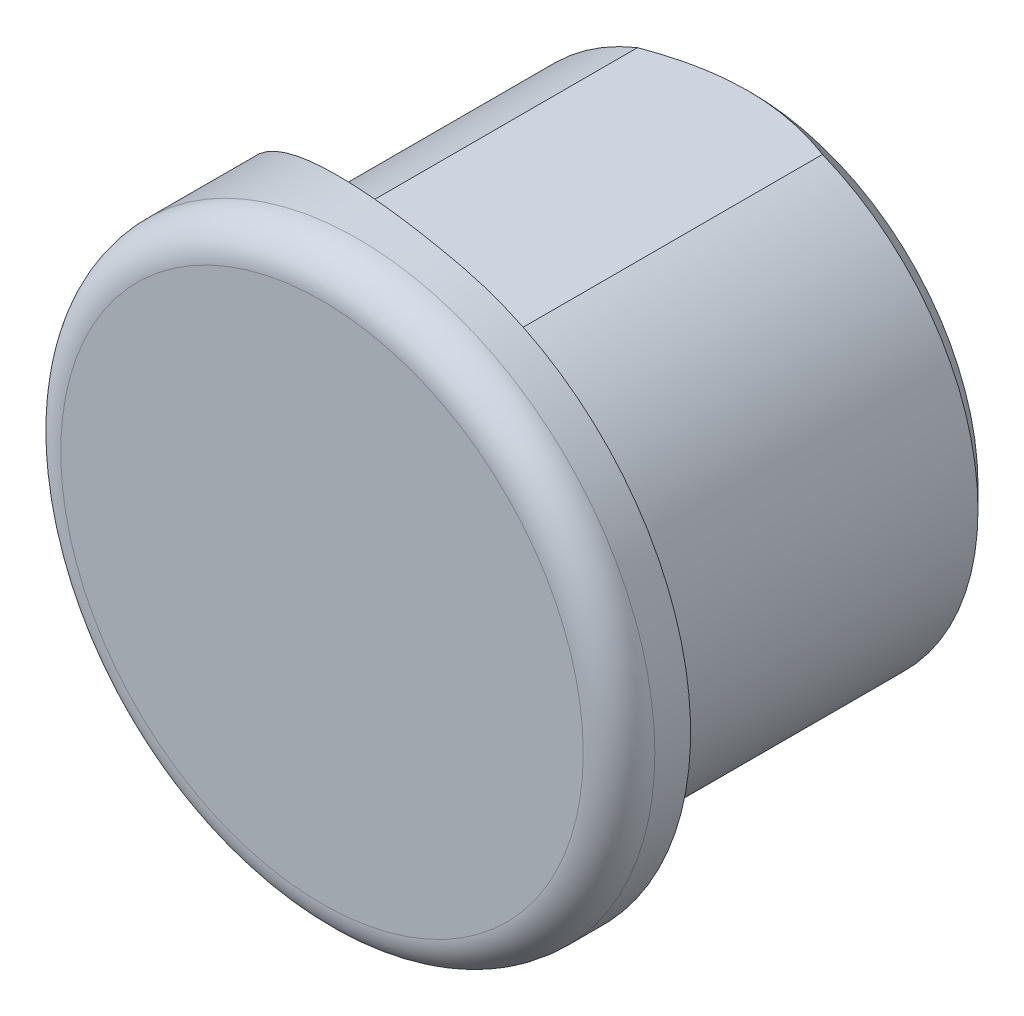
ISO-10303-21;
HEADER;
FILE_DESCRIPTION(('STEP AP214'),'2;1');
FILE_NAME('part.step','',(''),(''),'','','');
FILE_SCHEMA(('AUTOMOTIVE_DESIGN { 1 0 10303 214 1 1 1 1 }'));
ENDSEC;
DATA;
#1=APPLICATION_CONTEXT('core data for automotive mechanical design processes');
#2=APPLICATION_PROTOCOL_DEFINITION('international standard','automotive_design',2000,#1);
#3=PRODUCT_CONTEXT('',#1,'mechanical');
#4=PRODUCT('Part','Part','',(#3));
#5=PRODUCT_RELATED_PRODUCT_CATEGORY('part','',(#4));
#6=PRODUCT_DEFINITION_FORMATION('','',#4);
#7=PRODUCT_DEFINITION_CONTEXT('part definition',#1,'design');
#8=PRODUCT_DEFINITION('design','',#6,#7);
#9=PRODUCT_DEFINITION_SHAPE('','',#8);
#10=(LENGTH_UNIT() NAMED_UNIT(*) SI_UNIT(.MILLI.,.METRE.));
#11=(NAMED_UNIT(*) PLANE_ANGLE_UNIT() SI_UNIT($,.RADIAN.));
#12=(NAMED_UNIT(*) SI_UNIT($,.STERADIAN.) SOLID_ANGLE_UNIT());
#13=UNCERTAINTY_MEASURE_WITH_UNIT(LENGTH_MEASURE(1.E-05),#10,'distance_accuracy_value','');
#14=(GEOMETRIC_REPRESENTATION_CONTEXT(3) GLOBAL_UNCERTAINTY_ASSIGNED_CONTEXT((#13)) GLOBAL_UNIT_ASSIGNED_CONTEXT((#10,
#11,#12)) REPRESENTATION_CONTEXT('',''));
#15=CARTESIAN_POINT('',(0.,0.,0.));
#16=DIRECTION('',(0.,0.,1.));
#17=DIRECTION('',(1.,0.,0.));
#18=AXIS2_PLACEMENT_3D('',#15,#16,#17);
#19=CARTESIAN_POINT('',(-38.,67.,-5.));
#20=DIRECTION('',(0.,0.,1.));
#21=DIRECTION('',(1.,0.,0.));
#22=AXIS2_PLACEMENT_3D('',#19,#20,#21);
#23=CYLINDRICAL_SURFACE('',#22,3.46500000000001);
#24=DIRECTION('',(0.,0.,-1.));
#25=VECTOR('',#24,1.);
#26=CARTESIAN_POINT('',(-39.292284798332,70.215,1.001));
#27=LINE('',#26,#25);
#28=CARTESIAN_POINT('',(-39.292284798332,70.215,-0.325062518872274));
#29=VERTEX_POINT('',#28);
#30=CARTESIAN_POINT('',(-39.292284798332,70.215,-4.69999999999999));
#31=VERTEX_POINT('',#30);
#32=EDGE_CURVE('E88',#29,#31,#27,.T.);
#33=ORIENTED_EDGE('',*,*,#32,.T.);
#34=CARTESIAN_POINT('',(-38.,67.,-4.69999999999999));
#35=DIRECTION('',(0.,0.,1.));
#36=DIRECTION('',(1.,0.,0.));
#37=AXIS2_PLACEMENT_3D('',#34,#35,#36);
#38=CIRCLE('',#37,3.46500000000001);
#39=CARTESIAN_POINT('',(-36.707715201668,70.215,-4.69999999999999));
#40=VERTEX_POINT('',#39);
#41=EDGE_CURVE('E183',#31,#40,#38,.T.);
#42=ORIENTED_EDGE('',*,*,#41,.T.);
#43=DIRECTION('',(0.,0.,-1.));
#44=VECTOR('',#43,1.);
#45=CARTESIAN_POINT('',(-36.707715201668,70.215,1.001));
#46=LINE('',#45,#44);
#47=CARTESIAN_POINT('',(-36.707715201668,70.215,-0.00669751224309338));
#48=VERTEX_POINT('',#47);
#49=EDGE_CURVE('E64',#48,#40,#46,.T.);
#50=ORIENTED_EDGE('',*,*,#49,.F.);
#51=CARTESIAN_POINT('',(-36.707715201668,70.215,-0.00669751224308991));
#52=CARTESIAN_POINT('',(-36.7918183783078,70.2488185204064,-0.00324250262786544));
#53=CARTESIAN_POINT('',(-36.8773057208015,70.2793341167444,-0.00108298050502963));
#54=CARTESIAN_POINT('',(-37.0504348350583,70.3335805805809,0.000450538292791147));
#55=CARTESIAN_POINT('',(-37.1380767139506,70.3573111099645,-0.000175603822327148));
#56=CARTESIAN_POINT('',(-37.314706774626,70.3977626200402,-0.00440390113271462));
#57=CARTESIAN_POINT('',(-37.4036917414405,70.4144982210983,-0.00799980179883816));
#58=CARTESIAN_POINT('',(-37.5824954501393,70.4409436747735,-0.0182529538285457));
#59=CARTESIAN_POINT('',(-37.6723141235488,70.4506540993071,-0.0249099559170122));
#60=CARTESIAN_POINT('',(-37.9422216343316,70.4692000761917,-0.0495622920891564));
#61=CARTESIAN_POINT('',(-38.1227358424848,70.4674444008116,-0.0722383782416016));
#62=CARTESIAN_POINT('',(-38.4792957030401,70.4363558563484,-0.129381444895188));
#63=CARTESIAN_POINT('',(-38.655343795854,70.4070383963328,-0.163841830256444));
#64=CARTESIAN_POINT('',(-38.906675947637,70.345285350215,-0.221595639911068));
#65=CARTESIAN_POINT('',(-38.9854771372491,70.32291024204,-0.240999300845385));
#66=CARTESIAN_POINT('',(-39.140693117377,70.2728687221158,-0.281679130378347));
#67=CARTESIAN_POINT('',(-39.2171125794899,70.2452135408831,-0.302951273845802));
#68=CARTESIAN_POINT('',(-39.292284798332,70.2150000000001,-0.325062518872277));
#69=B_SPLINE_CURVE_WITH_KNOTS('',3,(#51,#52,#53,#54,#55,#56,#57,#58,#59,#60,#61,#62,#63,#64,#65,
#66,#67,#68),.UNSPECIFIED.,.F.,.F.,(4,2,2,2,2,2,2,2,4),(0.,0.272064995928714,0.544143547099019,
0.815650537801927,1.08713542275096,1.63018451754071,2.17293018832914,2.42529291181737,
2.67712473146622),.UNSPECIFIED.);
#70=CARTESIAN_POINT('',(-37.035,70.3279122584588,0.));
#71=VERTEX_POINT('',#70);
#72=EDGE_CURVE('E97',#48,#71,#69,.T.);
#73=ORIENTED_EDGE('',*,*,#72,.T.);
#74=CARTESIAN_POINT('',(-38.,67.,0.));
#75=DIRECTION('',(0.,0.,1.));
#76=DIRECTION('',(1.,0.,0.));
#77=AXIS2_PLACEMENT_3D('',#74,#75,#76);
#78=CIRCLE('',#77,3.46500000000001);
#79=CARTESIAN_POINT('',(-37.035,63.6720877415412,0.));
#80=VERTEX_POINT('',#79);
#81=EDGE_CURVE('E107',#80,#71,#78,.T.);
#82=ORIENTED_EDGE('',*,*,#81,.F.);
#83=CARTESIAN_POINT('',(-34.535,67.,-0.400657923214667));
#84=CARTESIAN_POINT('',(-34.5350011192577,67.0948957281984,-0.400656985389254));
#85=CARTESIAN_POINT('',(-34.5389055021327,67.1898219317335,-0.399368852872305));
#86=CARTESIAN_POINT('',(-34.5544772525292,67.3789822970893,-0.394274555914238));
#87=CARTESIAN_POINT('',(-34.5661491313663,67.4732160245484,-0.390466928172532));
#88=CARTESIAN_POINT('',(-34.6127558877772,67.7541885332388,-0.375441268165278));
#89=CARTESIAN_POINT('',(-34.6592816111299,67.9389586494806,-0.360620993873424));
#90=CARTESIAN_POINT('',(-34.7813833588734,68.2971146514612,-0.323725001024826));
#91=CARTESIAN_POINT('',(-34.8568782801617,68.470530751622,-0.301669563058351));
#92=CARTESIAN_POINT('',(-35.0346734192286,68.8023516732511,-0.253571784396536));
#93=CARTESIAN_POINT('',(-35.1369668349063,68.9607602901056,-0.227530456112169));
#94=CARTESIAN_POINT('',(-35.3695894581378,69.2638124229693,-0.174332423293026));
#95=CARTESIAN_POINT('',(-35.5007291471459,69.4078329346568,-0.147167177437789));
#96=CARTESIAN_POINT('',(-35.7857093632476,69.6722495530427,-0.0968249070936301));
#97=CARTESIAN_POINT('',(-35.9395523068001,69.792643141788,-0.0736483077125131));
#98=CARTESIAN_POINT('',(-36.2666303311044,70.0066542459041,-0.0352792019264993));
#99=CARTESIAN_POINT('',(-36.4399334825967,70.1001734247758,-0.0201158513601304));
#100=CARTESIAN_POINT('',(-36.8003942582355,70.2566425288117,-0.00140975183757399));
#101=CARTESIAN_POINT('',(-36.9875447090844,70.3196081555732,0.00213897132229998));
#102=CARTESIAN_POINT('',(-37.3585226743484,70.4101417603151,-0.0045170584851117));
#103=CARTESIAN_POINT('',(-37.5419178704721,70.4395440495656,-0.0139393400777888));
#104=CARTESIAN_POINT('',(-37.9098962281323,70.4687402686873,-0.0458414078334991));
#105=CARTESIAN_POINT('',(-38.094479209676,70.4685385836859,-0.068319259631799));
#106=CARTESIAN_POINT('',(-38.4541801556865,70.4397099509942,-0.124838159056097));
#107=CARTESIAN_POINT('',(-38.6294183252234,70.411882328781,-0.158536344344614));
#108=CARTESIAN_POINT('',(-38.9715232413143,70.3306606715974,-0.235937337453948));
#109=CARTESIAN_POINT('',(-39.1383881713702,70.2772611152933,-0.279642304813141));
#110=CARTESIAN_POINT('',(-39.4696837733798,70.1432500413001,-0.377411480404669));
#111=CARTESIAN_POINT('',(-39.6334122717408,70.0612402007051,-0.431929416844581));
#112=CARTESIAN_POINT('',(-39.9447447011074,69.8735464599806,-0.546079809336016));
#113=CARTESIAN_POINT('',(-40.092340152915,69.7678501989191,-0.605714925761603));
#114=CARTESIAN_POINT('',(-40.382724685148,69.5235598642113,-0.732246807786706));
#115=CARTESIAN_POINT('',(-40.5235882937771,69.3827437618093,-0.799277584037218));
#116=CARTESIAN_POINT('',(-40.7800987392563,69.0777274904943,-0.929290394936549));
#117=CARTESIAN_POINT('',(-40.8957282896773,68.9135114180864,-0.992269633406572));
#118=CARTESIAN_POINT('',(-41.0484614992409,68.6503627988322,-1.07932975913158));
#119=CARTESIAN_POINT('',(-41.0962979423923,68.5588207582527,-1.10736117138529));
#120=CARTESIAN_POINT('',(-41.1839240673632,68.3709764230694,-1.159749309023));
#121=CARTESIAN_POINT('',(-41.2237181048052,68.2746767404787,-1.18410802165));
#122=CARTESIAN_POINT('',(-41.294675136332,68.0780768734887,-1.22822655587355));
#123=CARTESIAN_POINT('',(-41.3258496853295,67.9777822530421,-1.24799252856462));
#124=CARTESIAN_POINT('',(-41.3791081012437,67.7739143771681,-1.28213352888147));
#125=CARTESIAN_POINT('',(-41.4011940970647,67.6703418956758,-1.29650981891721));
#126=CARTESIAN_POINT('',(-41.4334461318672,67.4754358475762,-1.31763605886592));
#127=CARTESIAN_POINT('',(-41.4448372613958,67.3843878309291,-1.32516512785783));
#128=CARTESIAN_POINT('',(-41.4603592015494,67.2014123130447,-1.33544570046317));
#129=CARTESIAN_POINT('',(-41.4644909869457,67.109484931554,-1.33819784551255));
#130=CARTESIAN_POINT('',(-41.4654201832672,66.9256031903779,-1.33881547526933));
#131=CARTESIAN_POINT('',(-41.4622200474372,66.8336488500067,-1.33668259449584));
#132=CARTESIAN_POINT('',(-41.4485574571683,66.65054665138,-1.32762645527127));
#133=CARTESIAN_POINT('',(-41.4380952964178,66.5593987606612,-1.3207033905433));
#134=CARTESIAN_POINT('',(-41.3991567922284,66.3084016400528,-1.29514526789084));
#135=CARTESIAN_POINT('',(-41.3630005351098,66.150167119285,-1.27159007893166));
#136=CARTESIAN_POINT('',(-41.2698850415623,65.8424143958316,-1.2126047075434));
#137=CARTESIAN_POINT('',(-41.2129195982387,65.6928988092471,-1.17717098228377));
#138=CARTESIAN_POINT('',(-41.0747103407353,65.3932075143471,-1.09436969996753));
#139=CARTESIAN_POINT('',(-40.9918608605046,65.2439796294623,-1.04626269629798));
#140=CARTESIAN_POINT('',(-40.8064224035896,64.9606532947735,-0.943967934044831));
#141=CARTESIAN_POINT('',(-40.7038219304809,64.826563728973,-0.889776641684433));
#142=CARTESIAN_POINT('',(-40.4634534285218,64.5555530744633,-0.77045182146391));
#143=CARTESIAN_POINT('',(-40.3226971434884,64.4214412832022,-0.704928243285893));
#144=CARTESIAN_POINT('',(-40.0201322502592,64.1781205054357,-0.575981722355459));
#145=CARTESIAN_POINT('',(-39.8583127691189,64.0689244612874,-0.512559885895578));
#146=CARTESIAN_POINT('',(-39.5075948292173,63.8733805738751,-0.389312821231469));
#147=CARTESIAN_POINT('',(-39.3177191923377,63.7885385095194,-0.329852799274537));
#148=CARTESIAN_POINT('',(-38.9227606879262,63.6536302915031,-0.223234961128988));
#149=CARTESIAN_POINT('',(-38.7176891958916,63.6035384094773,-0.176068059539049));
#150=CARTESIAN_POINT('',(-38.3159220961729,63.5439552757278,-0.100786488654761));
#151=CARTESIAN_POINT('',(-38.1199008637462,63.5314944461973,-0.0714346881586112));
#152=CARTESIAN_POINT('',(-37.7269724878194,63.5401975142087,-0.027536377717417));
#153=CARTESIAN_POINT('',(-37.5300658651042,63.5613437113143,-0.0129820807159925));
#154=CARTESIAN_POINT('',(-37.1583336236302,63.6338886683361,0.00103459603555801));
#155=CARTESIAN_POINT('',(-36.983027340551,63.6826450020609,0.00164400037690785));
#156=CARTESIAN_POINT('',(-36.6424697354413,63.8068530308265,-0.00781965603974612));
#157=CARTESIAN_POINT('',(-36.477218858977,63.8823059078124,-0.0178931898065255));
#158=CARTESIAN_POINT('',(-36.1598769632398,64.0583395311885,-0.0463988664987246));
#159=CARTESIAN_POINT('',(-36.0078962089916,64.1591079696991,-0.064894322054996));
#160=CARTESIAN_POINT('',(-35.7220175286328,64.382754681577,-0.107155832494376));
#161=CARTESIAN_POINT('',(-35.5881237451018,64.5056380050839,-0.130923091531641));
#162=CARTESIAN_POINT('',(-35.3339116935948,64.7785062773143,-0.181808882945439));
#163=CARTESIAN_POINT('',(-35.2148852828911,64.9296729836955,-0.209042849933061));
#164=CARTESIAN_POINT('',(-35.0032114322688,65.2500528969504,-0.261538577492637));
#165=CARTESIAN_POINT('',(-34.9105817823354,65.4192781692397,-0.286798999719347));
#166=CARTESIAN_POINT('',(-34.7926199931933,65.6852096901427,-0.320583376809268));
#167=CARTESIAN_POINT('',(-34.7565066355997,65.7770021463424,-0.331258845429686));
#168=CARTESIAN_POINT('',(-34.6921888233801,65.9635048078427,-0.350662151748602));
#169=CARTESIAN_POINT('',(-34.6639810801291,66.0582137816615,-0.359390798988086));
#170=CARTESIAN_POINT('',(-34.6157823568693,66.2496513067681,-0.374514950191058));
#171=CARTESIAN_POINT('',(-34.5957734288891,66.3463749543007,-0.380915546983146));
#172=CARTESIAN_POINT('',(-34.5640831796046,66.5412679108087,-0.391133445935712));
#173=CARTESIAN_POINT('',(-34.5523964880248,66.6394362457133,-0.394952413920624));
#174=CARTESIAN_POINT('',(-34.5416182925394,66.7815181372765,-0.398483270080353));
#175=CARTESIAN_POINT('',(-34.5391372354021,66.8251715777705,-0.399297907541584));
#176=CARTESIAN_POINT('',(-34.5358278257751,66.9125478547272,-0.400385451984138));
#177=CARTESIAN_POINT('',(-34.5349994842301,66.9562706916475,-0.400658355378025));
#178=CARTESIAN_POINT('',(-34.535,67.,-0.400657923214667));
#179=B_SPLINE_CURVE_WITH_KNOTS('',3,(#83,#84,#85,#86,#87,#88,#89,#90,#91,#92,#93,#94,#95,#96,
#97,#98,#99,#100,#101,#102,#103,#104,#105,#106,#107,#108,#109,#110,#111,#112,#113,#114,#115,
#116,#117,#118,#119,#120,#121,#122,#123,#124,#125,#126,#127,#128,#129,#130,#131,#132,#133,#134,
#135,#136,#137,#138,#139,#140,#141,#142,#143,#144,#145,#146,#147,#148,#149,#150,#151,#152,#153,
#154,#155,#156,#157,#158,#159,#160,#161,#162,#163,#164,#165,#166,#167,#168,#169,#170,#171,#172,
#173,#174,#175,#176,#177,#178),.UNSPECIFIED.,.T.,.F.,(4,2,2,2,2,2,2,2,2,2,2,2,2,2,2,2,2,2,2,2,2,
2,2,2,2,2,2,2,2,2,2,2,2,2,2,2,2,2,2,2,2,2,2,2,2,2,2,4),(0.,0.284640611948893,0.569446685927191,
1.13976936155237,1.70850685739108,2.27710013363597,2.86436883992426,3.45170009828666,
4.04115387217319,4.63030440165197,5.18542957441174,5.74047251861201,6.27991062964134,
6.81946526535747,7.39030547681752,7.9614442820149,8.58917713224544,9.21733866627191,
9.53802211699978,9.85853142314634,10.1786089618996,10.4986114828974,10.7744128568663,
11.0501771939033,11.3258492742678,11.6015102066413,12.0912349943867,12.5811059750482,
13.1110767275559,13.6413568970471,14.2541948851555,14.8673504877714,15.5127910043381,
16.1577531377056,16.7502830614329,17.342501009842,17.8858142321222,18.4291515117029,
18.9766425929876,19.5242588579601,20.1046453707213,20.6854221124281,20.9827604175396,
21.2799748498674,21.5765351306743,21.8729038695673,22.0040694646897,22.1352359284058),.UNSPECIFIED.);
#180=EDGE_CURVE('E101',#29,#80,#179,.T.);
#181=ORIENTED_EDGE('',*,*,#180,.F.);
#182=EDGE_LOOP('',(#33,#42,#50,#73,#82,#181));
#183=FACE_BOUND('',#182,.T.);
#184=ADVANCED_FACE('F43',(#183),#23,.T.);
#185=CARTESIAN_POINT('',(-38.,67.,-5.));
#186=DIRECTION('',(0.,0.,1.));
#187=DIRECTION('',(1.,0.,0.));
#188=AXIS2_PLACEMENT_3D('',#185,#186,#187);
#189=PLANE('',#188);
#190=CARTESIAN_POINT('',(-38.,67.,-5.));
#191=DIRECTION('',(0.,0.,1.));
#192=DIRECTION('',(1.,0.,0.));
#193=AXIS2_PLACEMENT_3D('',#190,#191,#192);
#194=CIRCLE('',#193,3.165);
#195=CARTESIAN_POINT('',(-34.835,67.,-5.));
#196=VERTEX_POINT('',#195);
#197=EDGE_CURVE('E58',#196,#196,#194,.F.);
#198=ORIENTED_EDGE('',*,*,#197,.T.);
#199=EDGE_LOOP('',(#198));
#200=FACE_BOUND('',#199,.T.);
#201=ADVANCED_FACE('F149',(#200),#189,.F.);
#202=CARTESIAN_POINT('',(-38.,67.,1.));
#203=DIRECTION('',(0.,0.,-1.));
#204=DIRECTION('',(-1.,0.,0.));
#205=AXIS2_PLACEMENT_3D('',#202,#203,#204);
#206=CYLINDRICAL_SURFACE('',#205,4.15);
#207=CARTESIAN_POINT('',(-37.035,71.0362451610377,0.));
#208=CARTESIAN_POINT('',(-37.1389135149355,71.0611079817524,1.89169779381795E-05));
#209=CARTESIAN_POINT('',(-37.2437955322097,71.081922915731,-0.00202389874618023));
#210=CARTESIAN_POINT('',(-37.4546683406772,71.1153939456416,-0.010323578353209));
#211=CARTESIAN_POINT('',(-37.5606589188467,71.1280515808569,-0.0165796467388777));
#212=CARTESIAN_POINT('',(-37.7725222945634,71.1451190816508,-0.0333616310134262));
#213=CARTESIAN_POINT('',(-37.8783937723876,71.1495627761947,-0.0438698154999375));
#214=CARTESIAN_POINT('',(-38.089658042955,71.1503757364488,-0.0691103473404647));
#215=CARTESIAN_POINT('',(-38.1950508378342,71.1467450382211,-0.0838426758281747));
#216=CARTESIAN_POINT('',(-38.4045601836983,71.1315679921022,-0.117389394789987));
#217=CARTESIAN_POINT('',(-38.5086773060836,71.1200253307163,-0.136201881363199));
#218=CARTESIAN_POINT('',(-38.7150075392414,71.0892739945365,-0.177680947209888));
#219=CARTESIAN_POINT('',(-38.8172199108204,71.0700624058739,-0.200348989550854));
#220=CARTESIAN_POINT('',(-39.1200758691205,71.0013389960265,-0.273715798384254));
#221=CARTESIAN_POINT('',(-39.3170192516607,70.9407323337533,-0.329790460113771));
#222=CARTESIAN_POINT('',(-39.7051398167684,70.7895099322629,-0.455867304034078));
#223=CARTESIAN_POINT('',(-39.8956665510677,70.6976747389526,-0.526379694514081));
#224=CARTESIAN_POINT('',(-40.2584168970998,70.4879769884797,-0.675514728598037));
#225=CARTESIAN_POINT('',(-40.430626987067,70.37009539813,-0.754143280514679));
#226=CARTESIAN_POINT('',(-40.7763646952639,70.0934969622362,-0.925803074440837));
#227=CARTESIAN_POINT('',(-40.9469519052243,69.9314198179557,-1.01934872426885));
#228=CARTESIAN_POINT('',(-41.2591187576431,69.579903700734,-1.20370117175869));
#229=CARTESIAN_POINT('',(-41.4006933858657,69.3904600076701,-1.29450749367446));
#230=CARTESIAN_POINT('',(-41.6349101216026,69.0130912477936,-1.45338544851009));
#231=CARTESIAN_POINT('',(-41.7315400700653,68.8282480086606,-1.52287631277185));
#232=CARTESIAN_POINT('',(-41.8971533464349,68.4417729767873,-1.64624764454559));
#233=CARTESIAN_POINT('',(-41.9661818795391,68.2401692937627,-1.70015359635628));
#234=CARTESIAN_POINT('',(-42.064693076734,67.8565339639283,-1.77862164178542));
#235=CARTESIAN_POINT('',(-42.0986557972807,67.6763332182839,-1.80644310750016));
#236=CARTESIAN_POINT('',(-42.1423965210148,67.3111164231759,-1.84245594291728));
#237=CARTESIAN_POINT('',(-42.1521934199031,67.1261042503263,-1.85066264960499));
#238=CARTESIAN_POINT('',(-42.1469771588566,66.7565597474659,-1.8463267732705));
#239=CARTESIAN_POINT('',(-42.1319462428684,66.572027855481,-1.83376934039776));
#240=CARTESIAN_POINT('',(-42.0780251727898,66.2088046245632,-1.78960027745198));
#241=CARTESIAN_POINT('',(-42.0391165958171,66.0301179077298,-1.75797393503358));
#242=CARTESIAN_POINT('',(-41.9389745922965,65.6807631636107,-1.67899584016737));
#243=CARTESIAN_POINT('',(-41.8775086433209,65.5102003494238,-1.63148077629907));
#244=CARTESIAN_POINT('',(-41.734633723052,65.1814331915484,-1.52532962372409));
#245=CARTESIAN_POINT('',(-41.6532178052639,65.0232331778952,-1.46668966298444));
#246=CARTESIAN_POINT('',(-41.4540060687908,64.6897346547747,-1.32993726480183));
#247=CARTESIAN_POINT('',(-41.3321811201858,64.5174714539867,-1.25028721984197));
#248=CARTESIAN_POINT('',(-41.0649358255179,64.1941549796061,-1.087387809847));
#249=CARTESIAN_POINT('',(-40.9194903436855,64.0431246239115,-1.00413468059121));
#250=CARTESIAN_POINT('',(-40.579381173062,63.7396640988152,-0.825023159385072));
#251=CARTESIAN_POINT('',(-40.3805582161435,63.5916034101299,-0.729504987108265));
#252=CARTESIAN_POINT('',(-40.0625965436332,63.3967106548949,-0.594121255174185));
#253=CARTESIAN_POINT('',(-39.9532573852021,63.3362542878907,-0.550287504788075));
#254=CARTESIAN_POINT('',(-39.7285038670213,63.2250204110157,-0.466116942361644));
#255=CARTESIAN_POINT('',(-39.6130929292975,63.1742375222387,-0.425778193780065));
#256=CARTESIAN_POINT('',(-39.3801271859431,63.0842739032036,-0.350493124651787));
#257=CARTESIAN_POINT('',(-39.2627191585208,63.0448119562349,-0.315428816153777));
#258=CARTESIAN_POINT('',(-39.0236573359609,62.9763107710146,-0.250123695618747));
#259=CARTESIAN_POINT('',(-38.902005918258,62.9472657962053,-0.219880233887203));
#260=CARTESIAN_POINT('',(-38.6555274650118,62.9001830814429,-0.164835236264505));
#261=CARTESIAN_POINT('',(-38.5307044580355,62.8821320401754,-0.140027147608859));
#262=CARTESIAN_POINT('',(-38.2789849889568,62.8574561668202,-0.0962771651299195));
#263=CARTESIAN_POINT('',(-38.1520893555799,62.8508268755138,-0.0773329843217852));
#264=CARTESIAN_POINT('',(-37.8592468401507,62.8490950314318,-0.0408330989229406));
#265=CARTESIAN_POINT('',(-37.6929762466876,62.8580350076893,-0.0253889437377299));
#266=CARTESIAN_POINT('',(-37.4448650401561,62.8864497947605,-0.0100731221140737));
#267=CARTESIAN_POINT('',(-37.3623177421114,62.8984363316898,-0.00627635143574174));
#268=CARTESIAN_POINT('',(-37.1979935560456,62.9273789114569,-0.00123807465226638));
#269=CARTESIAN_POINT('',(-37.1162169140965,62.9443364895338,2.64109797235787E-06));
#270=CARTESIAN_POINT('',(-37.035,62.9637548389623,0.));
#271=B_SPLINE_CURVE_WITH_KNOTS('',3,(#207,#208,#209,#210,#211,#212,#213,#214,#215,#216,#217,
#218,#219,#220,#221,#222,#223,#224,#225,#226,#227,#228,#229,#230,#231,#232,#233,#234,#235,#236,
#237,#238,#239,#240,#241,#242,#243,#244,#245,#246,#247,#248,#249,#250,#251,#252,#253,#254,#255,
#256,#257,#258,#259,#260,#261,#262,#263,#264,#265,#266,#267,#268,#269,#270),.UNSPECIFIED.,.F.,
.F.,(4,2,2,2,2,2,2,2,2,2,2,2,2,2,2,2,2,2,2,2,2,2,2,2,2,2,2,2,2,2,2,4),(0.,0.320439850221581,
0.64081921568246,0.959876139188177,1.27893163771129,1.59783857627413,1.91686680152822,
2.55467941541736,3.22098010275811,3.887769303564,4.64427560535393,5.40091254383847,
6.05796374542504,6.71393438654321,7.26790881305811,7.82144993926243,8.37538711167531,
8.92975221428211,9.49000005359216,10.0504432467285,10.7245021426198,11.3992830953165,
12.1920082700345,12.5887974923493,12.9853654331028,13.37100245008,13.7564267720334,
14.1413838465404,14.5261905940753,15.0261382377603,15.2764751104126,15.5268893778403),.UNSPECIFIED.);
#272=CARTESIAN_POINT('',(-37.035,71.0362451610377,0.));
#273=VERTEX_POINT('',#272);
#274=CARTESIAN_POINT('',(-37.035,62.9637548389623,0.));
#275=VERTEX_POINT('',#274);
#276=EDGE_CURVE('E71',#273,#275,#271,.T.);
#277=ORIENTED_EDGE('',*,*,#276,.T.);
#278=CARTESIAN_POINT('',(-38.,67.,0.));
#279=DIRECTION('',(0.,0.,1.));
#280=DIRECTION('',(1.,0.,0.));
#281=AXIS2_PLACEMENT_3D('',#278,#279,#280);
#282=CIRCLE('',#281,4.15);
#283=EDGE_CURVE('E108',#275,#273,#282,.T.);
#284=ORIENTED_EDGE('',*,*,#283,.T.);
#285=EDGE_LOOP('',(#277,#284));
#286=FACE_BOUND('',#285,.T.);
#287=CARTESIAN_POINT('',(-38.,67.,0.5));
#288=DIRECTION('',(0.,0.,1.));
#289=DIRECTION('',(1.,0.,0.));
#290=AXIS2_PLACEMENT_3D('',#287,#288,#289);
#291=CIRCLE('',#290,4.15);
#292=CARTESIAN_POINT('',(-33.85,67.,0.5));
#293=VERTEX_POINT('',#292);
#294=EDGE_CURVE('E176',#293,#293,#291,.F.);
#295=ORIENTED_EDGE('',*,*,#294,.T.);
#296=EDGE_LOOP('',(#295));
#297=FACE_BOUND('',#296,.T.);
#298=ADVANCED_FACE('F154',(#286,#297),#206,.T.);
#299=CARTESIAN_POINT('',(-38.,67.,1.));
#300=DIRECTION('',(0.,0.,1.));
#301=DIRECTION('',(1.,0.,0.));
#302=AXIS2_PLACEMENT_3D('',#299,#300,#301);
#303=PLANE('',#302);
#304=CARTESIAN_POINT('',(-38.,67.,1.));
#305=DIRECTION('',(0.,0.,1.));
#306=DIRECTION('',(1.,0.,0.));
#307=AXIS2_PLACEMENT_3D('',#304,#305,#306);
#308=CIRCLE('',#307,3.65);
#309=CARTESIAN_POINT('',(-34.35,67.,1.));
#310=VERTEX_POINT('',#309);
#311=EDGE_CURVE('E177',#310,#310,#308,.T.);
#312=ORIENTED_EDGE('',*,*,#311,.T.);
#313=EDGE_LOOP('',(#312));
#314=FACE_BOUND('',#313,.T.);
#315=ADVANCED_FACE('F130',(#314),#303,.T.);
#316=CARTESIAN_POINT('',(-38.,67.,0.));
#317=DIRECTION('',(0.,0.,1.));
#318=DIRECTION('',(1.,0.,0.));
#319=AXIS2_PLACEMENT_3D('',#316,#317,#318);
#320=PLANE('',#319);
#321=ORIENTED_EDGE('',*,*,#283,.F.);
#322=DIRECTION('',(0.,-1.,0.));
#323=VECTOR('',#322,1.);
#324=CARTESIAN_POINT('',(-37.035,73.15,0.));
#325=LINE('',#324,#323);
#326=EDGE_CURVE('E171',#275,#80,#325,.F.);
#327=ORIENTED_EDGE('',*,*,#326,.T.);
#328=ORIENTED_EDGE('',*,*,#81,.T.);
#329=EDGE_CURVE('E172',#71,#273,#325,.F.);
#330=ORIENTED_EDGE('',*,*,#329,.T.);
#331=EDGE_LOOP('',(#321,#327,#328,#330));
#332=FACE_BOUND('',#331,.T.);
#333=ADVANCED_FACE('F162',(#332),#320,.F.);
#334=CARTESIAN_POINT('',(-38.,67.,0.5));
#335=DIRECTION('',(0.,0.,1.));
#336=DIRECTION('',(1.,0.,0.));
#337=AXIS2_PLACEMENT_3D('',#334,#335,#336);
#338=TOROIDAL_SURFACE('',#337,3.65,0.5);
#339=ORIENTED_EDGE('',*,*,#294,.F.);
#340=EDGE_LOOP('',(#339));
#341=FACE_BOUND('',#340,.T.);
#342=ORIENTED_EDGE('',*,*,#311,.F.);
#343=EDGE_LOOP('',(#342));
#344=FACE_BOUND('',#343,.T.);
#345=ADVANCED_FACE('F128',(#341,#344),#338,.T.);
#346=CARTESIAN_POINT('',(-37.035,73.15,-8.));
#347=DIRECTION('',(0.,-1.,0.));
#348=DIRECTION('',(0.,0.,-1.));
#349=AXIS2_PLACEMENT_3D('',#346,#347,#348);
#350=CYLINDRICAL_SURFACE('',#349,8.);
#351=ORIENTED_EDGE('',*,*,#276,.F.);
#352=ORIENTED_EDGE('',*,*,#329,.F.);
#353=ORIENTED_EDGE('',*,*,#72,.F.);
#354=CARTESIAN_POINT('',(-37.035,70.215,-8.));
#355=DIRECTION('',(0.,-1.,0.));
#356=DIRECTION('',(0.,0.,-1.));
#357=AXIS2_PLACEMENT_3D('',#354,#355,#356);
#358=CIRCLE('',#357,8.);
#359=EDGE_CURVE('E91',#29,#48,#358,.F.);
#360=ORIENTED_EDGE('',*,*,#359,.F.);
#361=ORIENTED_EDGE('',*,*,#180,.T.);
#362=ORIENTED_EDGE('',*,*,#326,.F.);
#363=EDGE_LOOP('',(#351,#352,#353,#360,#361,#362));
#364=FACE_BOUND('',#363,.T.);
#365=ADVANCED_FACE('F100',(#364),#350,.F.);
#366=CARTESIAN_POINT('',(-38.,67.,-4.69999999999999));
#367=DIRECTION('',(0.,0.,1.));
#368=DIRECTION('',(1.,0.,0.));
#369=AXIS2_PLACEMENT_3D('',#366,#367,#368);
#370=CONICAL_SURFACE('',#369,3.46500000000001,0.785398163397445);
#371=CARTESIAN_POINT('',(-34.1055928354164,70.215,-3.11498691451597));
#372=CARTESIAN_POINT('',(-34.2003024258146,70.215,-3.18800712520098));
#373=CARTESIAN_POINT('',(-34.2955235708368,70.215,-3.26037439639326));
#374=CARTESIAN_POINT('',(-34.4872010360124,70.215,-3.40350104047268));
#375=CARTESIAN_POINT('',(-34.5836576473327,70.215,-3.47426002300622));
#376=CARTESIAN_POINT('',(-34.7787486178976,70.215,-3.6143899435058));
#377=CARTESIAN_POINT('',(-34.8773942164687,70.215,-3.683745285914));
#378=CARTESIAN_POINT('',(-35.0763409532689,70.215,-3.82003137696828));
#379=CARTESIAN_POINT('',(-35.1766419767555,70.215,-3.88696229263991));
#380=CARTESIAN_POINT('',(-35.3860809414981,70.215,-4.02229820688268));
#381=CARTESIAN_POINT('',(-35.4953554118401,70.215,-4.09049302000145));
#382=CARTESIAN_POINT('',(-35.7165153946036,70.215,-4.22258230949404));
#383=CARTESIAN_POINT('',(-35.8284013573129,70.215,-4.28647603676325));
#384=CARTESIAN_POINT('',(-36.054824324288,70.215,-4.40855633323256));
#385=CARTESIAN_POINT('',(-36.1693520911104,70.215,-4.46675989160016));
#386=CARTESIAN_POINT('',(-36.4017084930409,70.215,-4.5760921401587));
#387=CARTESIAN_POINT('',(-36.5195355007948,70.215,-4.62722424692754));
#388=CARTESIAN_POINT('',(-36.7540525512389,70.215,-4.71863639530162));
#389=CARTESIAN_POINT('',(-36.8706052840307,70.215,-4.75926395844251));
#390=CARTESIAN_POINT('',(-37.1068756333561,70.215,-4.83015124317017));
#391=CARTESIAN_POINT('',(-37.2265930919619,70.215,-4.86041148106465));
#392=CARTESIAN_POINT('',(-37.4658324636722,70.215,-4.90798483568899));
#393=CARTESIAN_POINT('',(-37.5852984769644,70.215,-4.92557325643951));
#394=CARTESIAN_POINT('',(-37.8254481324625,70.215,-4.94748322896245));
#395=CARTESIAN_POINT('',(-37.9461315287159,70.215,-4.9518074087562));
#396=CARTESIAN_POINT('',(-38.1877310724432,70.215,-4.94679935990068));
#397=CARTESIAN_POINT('',(-38.3086459630497,70.215,-4.93740788423934));
#398=CARTESIAN_POINT('',(-38.548754696071,70.215,-4.90567945433441));
#399=CARTESIAN_POINT('',(-38.6679480712007,70.215,-4.88333905051203));
#400=CARTESIAN_POINT('',(-38.906301135684,70.215,-4.82675515047934));
#401=CARTESIAN_POINT('',(-39.0253977542928,70.215,-4.79225119909016));
#402=CARTESIAN_POINT('',(-39.2602998064272,70.215,-4.71357754500104));
#403=CARTESIAN_POINT('',(-39.3761051555321,70.215,-4.66940759462192));
#404=CARTESIAN_POINT('',(-39.6030276043508,70.215,-4.57397611275536));
#405=CARTESIAN_POINT('',(-39.7141849926907,70.215,-4.52280913095168));
#406=CARTESIAN_POINT('',(-39.9335953360306,70.215,-4.4145457860184));
#407=CARTESIAN_POINT('',(-40.0418472327814,70.215,-4.35744729840344));
#408=CARTESIAN_POINT('',(-40.2559793711456,70.215,-4.23845847632876));
#409=CARTESIAN_POINT('',(-40.3618538305612,70.215,-4.17655781145158));
#410=CARTESIAN_POINT('',(-40.5713433788568,70.215,-4.04904000787484));
#411=CARTESIAN_POINT('',(-40.6749582294837,70.215,-3.98342247986855));
#412=CARTESIAN_POINT('',(-40.8737948297365,70.215,-3.85343109029288));
#413=CARTESIAN_POINT('',(-40.9691351346171,70.215,-3.789237746528));
#414=CARTESIAN_POINT('',(-41.1583419218992,70.215,-3.65870871403337));
#415=CARTESIAN_POINT('',(-41.2522083219023,70.215,-3.59237290615878));
#416=CARTESIAN_POINT('',(-41.4380929657214,70.215,-3.45834742047868));
#417=CARTESIAN_POINT('',(-41.5301190096764,70.215,-3.39066852884288));
#418=CARTESIAN_POINT('',(-41.7130547503134,70.215,-3.25385439995549));
#419=CARTESIAN_POINT('',(-41.8039646643551,70.215,-3.1847194536186));
#420=CARTESIAN_POINT('',(-41.8944071645835,70.215,-3.11498691451598));
#421=B_SPLINE_CURVE_WITH_KNOTS('',3,(#371,#372,#373,#374,#375,#376,#377,#378,#379,#380,#381,
#382,#383,#384,#385,#386,#387,#388,#389,#390,#391,#392,#393,#394,#395,#396,#397,#398,#399,#400,
#401,#402,#403,#404,#405,#406,#407,#408,#409,#410,#411,#412,#413,#414,#415,#416,#417,#418,#419,
#420),.UNSPECIFIED.,.F.,.F.,(4,2,2,2,2,2,2,2,2,2,2,2,2,2,2,2,2,2,2,2,2,2,2,2,4),(0.,
0.358777834881154,0.717641839704867,1.07937143251025,1.44107605717101,1.82742085957203,
2.21383277708447,2.59905329196726,2.98408703210494,3.35398847279456,3.72387148918218,
4.08545406662085,4.44696499969427,4.81004216450392,5.17321609711517,5.54469302441074,
5.91617947145471,6.28306754130089,6.65008747538065,7.01792008488072,7.38579129291144,
7.73056886353497,8.07536564075215,8.41804972815478,8.76066598605858),.UNSPECIFIED.);
#422=EDGE_CURVE('E11',#40,#31,#421,.T.);
#423=ORIENTED_EDGE('',*,*,#422,.F.);
#424=ORIENTED_EDGE('',*,*,#41,.F.);
#425=EDGE_LOOP('',(#423,#424));
#426=FACE_BOUND('',#425,.T.);
#427=ORIENTED_EDGE('',*,*,#197,.F.);
#428=EDGE_LOOP('',(#427));
#429=FACE_BOUND('',#428,.T.);
#430=ADVANCED_FACE('F46',(#426,#429),#370,.T.);
#431=CARTESIAN_POINT('',(-36.707715201668,70.215,1.001));
#432=DIRECTION('',(0.,-1.,0.));
#433=DIRECTION('',(0.,0.,-1.));
#434=AXIS2_PLACEMENT_3D('',#431,#432,#433);
#435=PLANE('',#434);
#436=ORIENTED_EDGE('',*,*,#422,.T.);
#437=ORIENTED_EDGE('',*,*,#32,.F.);
#438=ORIENTED_EDGE('',*,*,#359,.T.);
#439=ORIENTED_EDGE('',*,*,#49,.T.);
#440=EDGE_LOOP('',(#436,#437,#438,#439));
#441=FACE_BOUND('',#440,.T.);
#442=ADVANCED_FACE('F90',(#441),#435,.F.);
#443=CLOSED_SHELL('',(#184,#201,#298,#315,#333,#345,#365,#430,#442));
#444=MANIFOLD_SOLID_BREP('B2',#443);
#445=ADVANCED_BREP_SHAPE_REPRESENTATION('',(#18,#444),#14);
#446=SHAPE_DEFINITION_REPRESENTATION(#9,#445);
ENDSEC;
END-ISO-10303-21;
